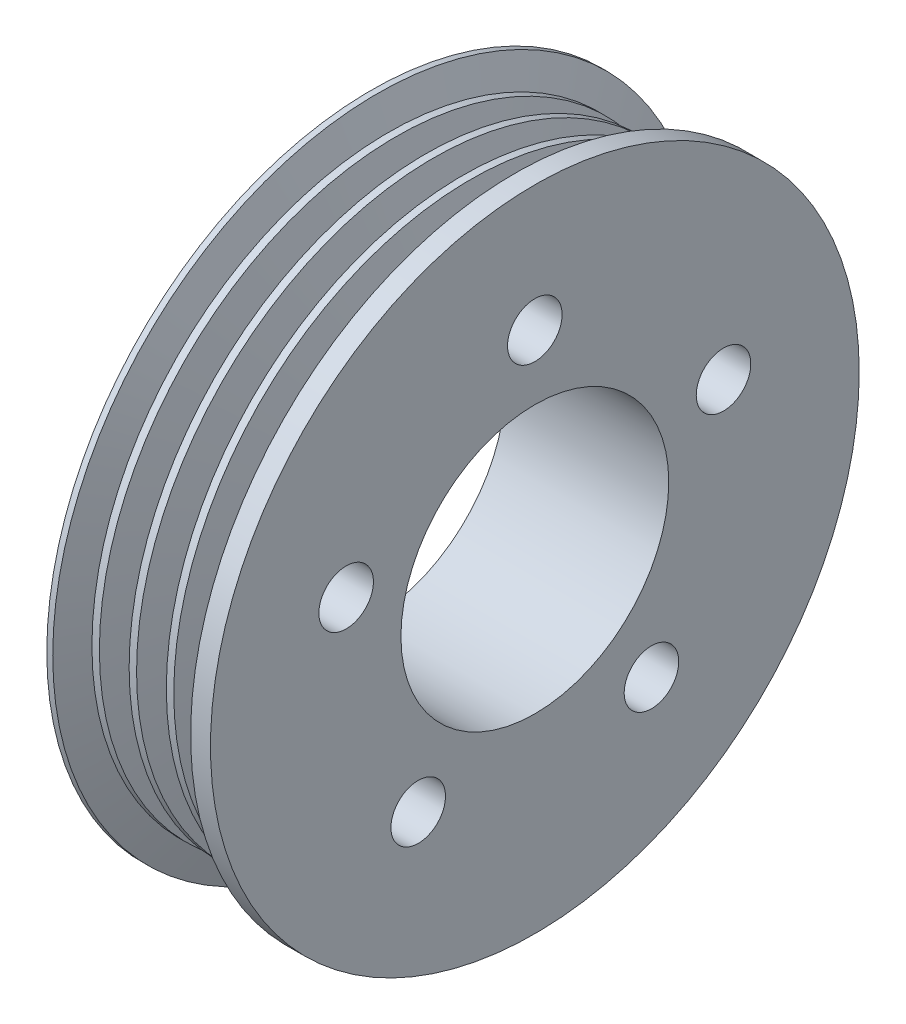
ISO-10303-21;
HEADER;
FILE_DESCRIPTION(('STEP AP214'),'2;1');
FILE_NAME('part.step','',(''),(''),'','','');
FILE_SCHEMA(('AUTOMOTIVE_DESIGN { 1 0 10303 214 1 1 1 1 }'));
ENDSEC;
DATA;
#1=APPLICATION_CONTEXT('core data for automotive mechanical design processes');
#2=APPLICATION_PROTOCOL_DEFINITION('international standard','automotive_design',2000,#1);
#3=PRODUCT_CONTEXT('',#1,'mechanical');
#4=PRODUCT('Part','Part','',(#3));
#5=PRODUCT_RELATED_PRODUCT_CATEGORY('part','',(#4));
#6=PRODUCT_DEFINITION_FORMATION('','',#4);
#7=PRODUCT_DEFINITION_CONTEXT('part definition',#1,'design');
#8=PRODUCT_DEFINITION('design','',#6,#7);
#9=PRODUCT_DEFINITION_SHAPE('','',#8);
#10=(LENGTH_UNIT() NAMED_UNIT(*) SI_UNIT(.MILLI.,.METRE.));
#11=(NAMED_UNIT(*) PLANE_ANGLE_UNIT() SI_UNIT($,.RADIAN.));
#12=(NAMED_UNIT(*) SI_UNIT($,.STERADIAN.) SOLID_ANGLE_UNIT());
#13=UNCERTAINTY_MEASURE_WITH_UNIT(LENGTH_MEASURE(1.E-05),#10,'distance_accuracy_value','');
#14=(GEOMETRIC_REPRESENTATION_CONTEXT(3) GLOBAL_UNCERTAINTY_ASSIGNED_CONTEXT((#13)) GLOBAL_UNIT_ASSIGNED_CONTEXT((#10,
#11,#12)) REPRESENTATION_CONTEXT('',''));
#15=CARTESIAN_POINT('',(0.,0.,0.));
#16=DIRECTION('',(0.,0.,1.));
#17=DIRECTION('',(1.,0.,0.));
#18=AXIS2_PLACEMENT_3D('',#15,#16,#17);
#19=CARTESIAN_POINT('',(0.,0.,0.));
#20=DIRECTION('',(-1.,0.,0.));
#21=DIRECTION('',(0.,0.,1.));
#22=AXIS2_PLACEMENT_3D('',#19,#20,#21);
#23=CYLINDRICAL_SURFACE('',#22,29.9);
#24=CARTESIAN_POINT('',(13.0000000000001,0.,0.));
#25=DIRECTION('',(-1.,0.,0.));
#26=DIRECTION('',(0.,0.,1.));
#27=AXIS2_PLACEMENT_3D('',#24,#25,#26);
#28=CIRCLE('',#27,29.9);
#29=CARTESIAN_POINT('',(13.0000000000001,0.,29.9));
#30=VERTEX_POINT('',#29);
#31=EDGE_CURVE('E168',#30,#30,#28,.T.);
#32=ORIENTED_EDGE('',*,*,#31,.F.);
#33=EDGE_LOOP('',(#32));
#34=FACE_BOUND('',#33,.T.);
#35=CARTESIAN_POINT('',(14.5000000000001,0.,0.));
#36=DIRECTION('',(1.,0.,0.));
#37=DIRECTION('',(0.,0.,-1.));
#38=AXIS2_PLACEMENT_3D('',#35,#36,#37);
#39=CIRCLE('',#38,29.9);
#40=CARTESIAN_POINT('',(14.5000000000001,0.,-29.9));
#41=VERTEX_POINT('',#40);
#42=EDGE_CURVE('E10',#41,#41,#39,.T.);
#43=ORIENTED_EDGE('',*,*,#42,.F.);
#44=EDGE_LOOP('',(#43));
#45=FACE_BOUND('',#44,.T.);
#46=ADVANCED_FACE('F36',(#34,#45),#23,.T.);
#47=CARTESIAN_POINT('',(0.,0.,0.));
#48=DIRECTION('',(-1.,0.,0.));
#49=DIRECTION('',(0.,0.,1.));
#50=AXIS2_PLACEMENT_3D('',#47,#48,#49);
#51=CYLINDRICAL_SURFACE('',#50,29.9);
#52=CARTESIAN_POINT('',(2.5,0.,0.));
#53=DIRECTION('',(-1.,0.,0.));
#54=DIRECTION('',(0.,0.,1.));
#55=AXIS2_PLACEMENT_3D('',#52,#53,#54);
#56=CIRCLE('',#55,29.9);
#57=CARTESIAN_POINT('',(2.5,0.,29.9));
#58=VERTEX_POINT('',#57);
#59=EDGE_CURVE('E124',#58,#58,#56,.T.);
#60=ORIENTED_EDGE('',*,*,#59,.T.);
#61=EDGE_LOOP('',(#60));
#62=FACE_BOUND('',#61,.T.);
#63=CARTESIAN_POINT('',(1.75,0.,0.));
#64=DIRECTION('',(-1.,0.,0.));
#65=DIRECTION('',(0.,0.,1.));
#66=AXIS2_PLACEMENT_3D('',#63,#64,#65);
#67=CIRCLE('',#66,29.9);
#68=CARTESIAN_POINT('',(1.75,0.,29.9));
#69=VERTEX_POINT('',#68);
#70=EDGE_CURVE('E40',#69,#69,#67,.T.);
#71=ORIENTED_EDGE('',*,*,#70,.F.);
#72=EDGE_LOOP('',(#71));
#73=FACE_BOUND('',#72,.T.);
#74=ADVANCED_FACE('F183',(#62,#73),#51,.T.);
#75=CARTESIAN_POINT('',(0.,29.9,0.));
#76=DIRECTION('',(1.,0.,0.));
#77=DIRECTION('',(0.,0.,-1.));
#78=AXIS2_PLACEMENT_3D('',#75,#76,#77);
#79=PLANE('',#78);
#80=CARTESIAN_POINT('',(0.,6.18033988749916,19.021130325903));
#81=DIRECTION('',(-1.,0.,0.));
#82=DIRECTION('',(0.,0.,1.));
#83=AXIS2_PLACEMENT_3D('',#80,#81,#82);
#84=CIRCLE('',#83,5.2);
#85=CARTESIAN_POINT('',(0.,6.18033988749916,24.221130325903));
#86=VERTEX_POINT('',#85);
#87=EDGE_CURVE('E64',#86,#86,#84,.T.);
#88=ORIENTED_EDGE('',*,*,#87,.F.);
#89=EDGE_LOOP('',(#88));
#90=FACE_BOUND('',#89,.T.);
#91=CARTESIAN_POINT('',(0.,-16.1803398874988,11.7557050458496));
#92=DIRECTION('',(-1.,0.,0.));
#93=DIRECTION('',(0.,0.,1.));
#94=AXIS2_PLACEMENT_3D('',#91,#92,#93);
#95=CIRCLE('',#94,5.2);
#96=CARTESIAN_POINT('',(0.,-16.1803398874988,16.9557050458496));
#97=VERTEX_POINT('',#96);
#98=EDGE_CURVE('E76',#97,#97,#95,.T.);
#99=ORIENTED_EDGE('',*,*,#98,.F.);
#100=EDGE_LOOP('',(#99));
#101=FACE_BOUND('',#100,.T.);
#102=CARTESIAN_POINT('',(0.,-16.180339887499,-11.7557050458494));
#103=DIRECTION('',(-1.,0.,0.));
#104=DIRECTION('',(0.,0.,1.));
#105=AXIS2_PLACEMENT_3D('',#102,#103,#104);
#106=CIRCLE('',#105,5.2);
#107=CARTESIAN_POINT('',(0.,-16.180339887499,-6.55570504584937));
#108=VERTEX_POINT('',#107);
#109=EDGE_CURVE('E88',#108,#108,#106,.T.);
#110=ORIENTED_EDGE('',*,*,#109,.F.);
#111=EDGE_LOOP('',(#110));
#112=FACE_BOUND('',#111,.T.);
#113=CARTESIAN_POINT('',(0.,6.1803398874989,-19.0211303259031));
#114=DIRECTION('',(-1.,0.,0.));
#115=DIRECTION('',(0.,0.,1.));
#116=AXIS2_PLACEMENT_3D('',#113,#114,#115);
#117=CIRCLE('',#116,5.2);
#118=CARTESIAN_POINT('',(0.,6.1803398874989,-13.8211303259031));
#119=VERTEX_POINT('',#118);
#120=EDGE_CURVE('E100',#119,#119,#117,.T.);
#121=ORIENTED_EDGE('',*,*,#120,.F.);
#122=EDGE_LOOP('',(#121));
#123=FACE_BOUND('',#122,.T.);
#124=CARTESIAN_POINT('',(0.,20.,0.));
#125=DIRECTION('',(-1.,0.,0.));
#126=DIRECTION('',(0.,0.,1.));
#127=AXIS2_PLACEMENT_3D('',#124,#125,#126);
#128=CIRCLE('',#127,5.2);
#129=CARTESIAN_POINT('',(0.,20.,5.2));
#130=VERTEX_POINT('',#129);
#131=EDGE_CURVE('E112',#130,#130,#128,.T.);
#132=ORIENTED_EDGE('',*,*,#131,.F.);
#133=EDGE_LOOP('',(#132));
#134=FACE_BOUND('',#133,.T.);
#135=CARTESIAN_POINT('',(0.,0.,0.));
#136=DIRECTION('',(-1.,0.,0.));
#137=DIRECTION('',(0.,0.,1.));
#138=AXIS2_PLACEMENT_3D('',#135,#136,#137);
#139=CIRCLE('',#138,13.5);
#140=CARTESIAN_POINT('',(0.,0.,13.5));
#141=VERTEX_POINT('',#140);
#142=EDGE_CURVE('E50',#141,#141,#139,.T.);
#143=ORIENTED_EDGE('',*,*,#142,.F.);
#144=EDGE_LOOP('',(#143));
#145=FACE_BOUND('',#144,.T.);
#146=CARTESIAN_POINT('',(0.,0.,0.));
#147=DIRECTION('',(-1.,0.,0.));
#148=DIRECTION('',(0.,0.,1.));
#149=AXIS2_PLACEMENT_3D('',#146,#147,#148);
#150=CIRCLE('',#149,32.7);
#151=CARTESIAN_POINT('',(0.,0.,32.7));
#152=VERTEX_POINT('',#151);
#153=EDGE_CURVE('E59',#152,#152,#150,.T.);
#154=ORIENTED_EDGE('',*,*,#153,.T.);
#155=EDGE_LOOP('',(#154));
#156=FACE_BOUND('',#155,.T.);
#157=ADVANCED_FACE('F38',(#90,#101,#112,#123,#134,#145,#156),#79,.F.);
#158=CARTESIAN_POINT('',(0.,0.,0.));
#159=DIRECTION('',(-1.,0.,0.));
#160=DIRECTION('',(0.,0.,1.));
#161=AXIS2_PLACEMENT_3D('',#158,#159,#160);
#162=CYLINDRICAL_SURFACE('',#161,13.5);
#163=CARTESIAN_POINT('',(16.5000000000001,0.,0.));
#164=DIRECTION('',(-1.,0.,0.));
#165=DIRECTION('',(0.,0.,1.));
#166=AXIS2_PLACEMENT_3D('',#163,#164,#165);
#167=CIRCLE('',#166,13.5);
#168=CARTESIAN_POINT('',(16.5000000000001,0.,13.5));
#169=VERTEX_POINT('',#168);
#170=EDGE_CURVE('E172',#169,#169,#167,.T.);
#171=ORIENTED_EDGE('',*,*,#170,.F.);
#172=EDGE_LOOP('',(#171));
#173=FACE_BOUND('',#172,.T.);
#174=ORIENTED_EDGE('',*,*,#142,.T.);
#175=EDGE_LOOP('',(#174));
#176=FACE_BOUND('',#175,.T.);
#177=ADVANCED_FACE('F179',(#173,#176),#162,.F.);
#178=CARTESIAN_POINT('',(16.5000000000001,29.9,0.));
#179=DIRECTION('',(-1.,0.,0.));
#180=DIRECTION('',(0.,0.,1.));
#181=AXIS2_PLACEMENT_3D('',#178,#179,#180);
#182=PLANE('',#181);
#183=CARTESIAN_POINT('',(16.5000000000001,6.18033988749916,19.021130325903));
#184=DIRECTION('',(-1.,0.,0.));
#185=DIRECTION('',(0.,0.,1.));
#186=AXIS2_PLACEMENT_3D('',#183,#184,#185);
#187=CIRCLE('',#186,2.75);
#188=CARTESIAN_POINT('',(16.5000000000001,6.18033988749916,21.771130325903));
#189=VERTEX_POINT('',#188);
#190=EDGE_CURVE('E72',#189,#189,#187,.T.);
#191=ORIENTED_EDGE('',*,*,#190,.T.);
#192=EDGE_LOOP('',(#191));
#193=FACE_BOUND('',#192,.T.);
#194=CARTESIAN_POINT('',(16.5000000000001,-16.1803398874988,11.7557050458496));
#195=DIRECTION('',(-1.,0.,0.));
#196=DIRECTION('',(0.,0.,1.));
#197=AXIS2_PLACEMENT_3D('',#194,#195,#196);
#198=CIRCLE('',#197,2.75);
#199=CARTESIAN_POINT('',(16.5000000000001,-16.1803398874988,14.5057050458496));
#200=VERTEX_POINT('',#199);
#201=EDGE_CURVE('E84',#200,#200,#198,.T.);
#202=ORIENTED_EDGE('',*,*,#201,.T.);
#203=EDGE_LOOP('',(#202));
#204=FACE_BOUND('',#203,.T.);
#205=CARTESIAN_POINT('',(16.5000000000001,-16.180339887499,-11.7557050458494));
#206=DIRECTION('',(-1.,0.,0.));
#207=DIRECTION('',(0.,0.,1.));
#208=AXIS2_PLACEMENT_3D('',#205,#206,#207);
#209=CIRCLE('',#208,2.75);
#210=CARTESIAN_POINT('',(16.5000000000001,-16.180339887499,-9.00570504584937));
#211=VERTEX_POINT('',#210);
#212=EDGE_CURVE('E96',#211,#211,#209,.T.);
#213=ORIENTED_EDGE('',*,*,#212,.T.);
#214=EDGE_LOOP('',(#213));
#215=FACE_BOUND('',#214,.T.);
#216=CARTESIAN_POINT('',(16.5000000000001,6.1803398874989,-19.0211303259031));
#217=DIRECTION('',(-1.,0.,0.));
#218=DIRECTION('',(0.,0.,1.));
#219=AXIS2_PLACEMENT_3D('',#216,#217,#218);
#220=CIRCLE('',#219,2.75);
#221=CARTESIAN_POINT('',(16.5000000000001,6.1803398874989,-16.2711303259031));
#222=VERTEX_POINT('',#221);
#223=EDGE_CURVE('E108',#222,#222,#220,.T.);
#224=ORIENTED_EDGE('',*,*,#223,.T.);
#225=EDGE_LOOP('',(#224));
#226=FACE_BOUND('',#225,.T.);
#227=CARTESIAN_POINT('',(16.5000000000001,20.,0.));
#228=DIRECTION('',(-1.,0.,0.));
#229=DIRECTION('',(0.,0.,1.));
#230=AXIS2_PLACEMENT_3D('',#227,#228,#229);
#231=CIRCLE('',#230,2.75);
#232=CARTESIAN_POINT('',(16.5000000000001,20.,2.75));
#233=VERTEX_POINT('',#232);
#234=EDGE_CURVE('E120',#233,#233,#231,.T.);
#235=ORIENTED_EDGE('',*,*,#234,.T.);
#236=EDGE_LOOP('',(#235));
#237=FACE_BOUND('',#236,.T.);
#238=ORIENTED_EDGE('',*,*,#170,.T.);
#239=EDGE_LOOP('',(#238));
#240=FACE_BOUND('',#239,.T.);
#241=CARTESIAN_POINT('',(16.5000000000001,0.,0.));
#242=DIRECTION('',(1.,0.,0.));
#243=DIRECTION('',(0.,0.,-1.));
#244=AXIS2_PLACEMENT_3D('',#241,#242,#243);
#245=CIRCLE('',#244,32.7);
#246=CARTESIAN_POINT('',(16.5000000000001,0.,-32.7));
#247=VERTEX_POINT('',#246);
#248=EDGE_CURVE('E53',#247,#247,#245,.T.);
#249=ORIENTED_EDGE('',*,*,#248,.T.);
#250=EDGE_LOOP('',(#249));
#251=FACE_BOUND('',#250,.T.);
#252=ADVANCED_FACE('F255',(#193,#204,#215,#226,#237,#240,#251),#182,.F.);
#253=CARTESIAN_POINT('',(13.0000000000001,0.,0.));
#254=DIRECTION('',(1.,0.,0.));
#255=DIRECTION('',(0.,0.,-1.));
#256=AXIS2_PLACEMENT_3D('',#253,#254,#255);
#257=CONICAL_SURFACE('',#256,29.9,1.3542460218188);
#258=CARTESIAN_POINT('',(11.9,0.,0.));
#259=DIRECTION('',(-1.,0.,0.));
#260=DIRECTION('',(0.,0.,1.));
#261=AXIS2_PLACEMENT_3D('',#258,#259,#260);
#262=CIRCLE('',#261,24.9);
#263=CARTESIAN_POINT('',(11.9,0.,24.9));
#264=VERTEX_POINT('',#263);
#265=EDGE_CURVE('E164',#264,#264,#262,.T.);
#266=ORIENTED_EDGE('',*,*,#265,.F.);
#267=EDGE_LOOP('',(#266));
#268=FACE_BOUND('',#267,.T.);
#269=ORIENTED_EDGE('',*,*,#31,.T.);
#270=EDGE_LOOP('',(#269));
#271=FACE_BOUND('',#270,.T.);
#272=ADVANCED_FACE('F252',(#268,#271),#257,.T.);
#273=CARTESIAN_POINT('',(0.,0.,0.));
#274=DIRECTION('',(-1.,0.,0.));
#275=DIRECTION('',(0.,0.,1.));
#276=AXIS2_PLACEMENT_3D('',#273,#274,#275);
#277=CYLINDRICAL_SURFACE('',#276,24.9);
#278=CARTESIAN_POINT('',(11.1,0.,0.));
#279=DIRECTION('',(-1.,0.,0.));
#280=DIRECTION('',(0.,0.,1.));
#281=AXIS2_PLACEMENT_3D('',#278,#279,#280);
#282=CIRCLE('',#281,24.9);
#283=CARTESIAN_POINT('',(11.1,0.,24.9));
#284=VERTEX_POINT('',#283);
#285=EDGE_CURVE('E160',#284,#284,#282,.T.);
#286=ORIENTED_EDGE('',*,*,#285,.F.);
#287=EDGE_LOOP('',(#286));
#288=FACE_BOUND('',#287,.T.);
#289=ORIENTED_EDGE('',*,*,#265,.T.);
#290=EDGE_LOOP('',(#289));
#291=FACE_BOUND('',#290,.T.);
#292=ADVANCED_FACE('F248',(#288,#291),#277,.T.);
#293=CARTESIAN_POINT('',(11.1,0.,0.));
#294=DIRECTION('',(-1.,0.,0.));
#295=DIRECTION('',(0.,0.,1.));
#296=AXIS2_PLACEMENT_3D('',#293,#294,#295);
#297=CONICAL_SURFACE('',#296,24.9,1.35424602181881);
#298=CARTESIAN_POINT('',(10.,0.,0.));
#299=DIRECTION('',(-1.,0.,0.));
#300=DIRECTION('',(0.,0.,1.));
#301=AXIS2_PLACEMENT_3D('',#298,#299,#300);
#302=CIRCLE('',#301,29.9);
#303=CARTESIAN_POINT('',(10.,0.,29.9));
#304=VERTEX_POINT('',#303);
#305=EDGE_CURVE('E156',#304,#304,#302,.T.);
#306=ORIENTED_EDGE('',*,*,#305,.F.);
#307=EDGE_LOOP('',(#306));
#308=FACE_BOUND('',#307,.T.);
#309=ORIENTED_EDGE('',*,*,#285,.T.);
#310=EDGE_LOOP('',(#309));
#311=FACE_BOUND('',#310,.T.);
#312=ADVANCED_FACE('F244',(#308,#311),#297,.T.);
#313=CARTESIAN_POINT('',(0.,0.,0.));
#314=DIRECTION('',(-1.,0.,0.));
#315=DIRECTION('',(0.,0.,1.));
#316=AXIS2_PLACEMENT_3D('',#313,#314,#315);
#317=CYLINDRICAL_SURFACE('',#316,29.9);
#318=CARTESIAN_POINT('',(9.24999999999998,0.,0.));
#319=DIRECTION('',(-1.,0.,0.));
#320=DIRECTION('',(0.,0.,1.));
#321=AXIS2_PLACEMENT_3D('',#318,#319,#320);
#322=CIRCLE('',#321,29.9);
#323=CARTESIAN_POINT('',(9.24999999999998,0.,29.9));
#324=VERTEX_POINT('',#323);
#325=EDGE_CURVE('E152',#324,#324,#322,.T.);
#326=ORIENTED_EDGE('',*,*,#325,.F.);
#327=EDGE_LOOP('',(#326));
#328=FACE_BOUND('',#327,.T.);
#329=ORIENTED_EDGE('',*,*,#305,.T.);
#330=EDGE_LOOP('',(#329));
#331=FACE_BOUND('',#330,.T.);
#332=ADVANCED_FACE('F240',(#328,#331),#317,.T.);
#333=CARTESIAN_POINT('',(9.24999999999998,0.,0.));
#334=DIRECTION('',(1.,0.,0.));
#335=DIRECTION('',(0.,0.,-1.));
#336=AXIS2_PLACEMENT_3D('',#333,#334,#335);
#337=CONICAL_SURFACE('',#336,29.9,1.35424602181881);
#338=CARTESIAN_POINT('',(8.14999999999999,0.,0.));
#339=DIRECTION('',(-1.,0.,0.));
#340=DIRECTION('',(0.,0.,1.));
#341=AXIS2_PLACEMENT_3D('',#338,#339,#340);
#342=CIRCLE('',#341,24.9);
#343=CARTESIAN_POINT('',(8.14999999999999,0.,24.9));
#344=VERTEX_POINT('',#343);
#345=EDGE_CURVE('E148',#344,#344,#342,.T.);
#346=ORIENTED_EDGE('',*,*,#345,.F.);
#347=EDGE_LOOP('',(#346));
#348=FACE_BOUND('',#347,.T.);
#349=ORIENTED_EDGE('',*,*,#325,.T.);
#350=EDGE_LOOP('',(#349));
#351=FACE_BOUND('',#350,.T.);
#352=ADVANCED_FACE('F236',(#348,#351),#337,.T.);
#353=CARTESIAN_POINT('',(0.,0.,0.));
#354=DIRECTION('',(-1.,0.,0.));
#355=DIRECTION('',(0.,0.,1.));
#356=AXIS2_PLACEMENT_3D('',#353,#354,#355);
#357=CYLINDRICAL_SURFACE('',#356,24.9);
#358=CARTESIAN_POINT('',(7.35000000000001,0.,0.));
#359=DIRECTION('',(-1.,0.,0.));
#360=DIRECTION('',(0.,0.,1.));
#361=AXIS2_PLACEMENT_3D('',#358,#359,#360);
#362=CIRCLE('',#361,24.9);
#363=CARTESIAN_POINT('',(7.35000000000001,0.,24.9));
#364=VERTEX_POINT('',#363);
#365=EDGE_CURVE('E144',#364,#364,#362,.T.);
#366=ORIENTED_EDGE('',*,*,#365,.F.);
#367=EDGE_LOOP('',(#366));
#368=FACE_BOUND('',#367,.T.);
#369=ORIENTED_EDGE('',*,*,#345,.T.);
#370=EDGE_LOOP('',(#369));
#371=FACE_BOUND('',#370,.T.);
#372=ADVANCED_FACE('F232',(#368,#371),#357,.T.);
#373=CARTESIAN_POINT('',(7.35000000000001,0.,0.));
#374=DIRECTION('',(-1.,0.,0.));
#375=DIRECTION('',(0.,0.,1.));
#376=AXIS2_PLACEMENT_3D('',#373,#374,#375);
#377=CONICAL_SURFACE('',#376,24.9,1.35424602181881);
#378=CARTESIAN_POINT('',(6.25000000000001,0.,0.));
#379=DIRECTION('',(-1.,0.,0.));
#380=DIRECTION('',(0.,0.,1.));
#381=AXIS2_PLACEMENT_3D('',#378,#379,#380);
#382=CIRCLE('',#381,29.9);
#383=CARTESIAN_POINT('',(6.25000000000001,0.,29.9));
#384=VERTEX_POINT('',#383);
#385=EDGE_CURVE('E140',#384,#384,#382,.T.);
#386=ORIENTED_EDGE('',*,*,#385,.F.);
#387=EDGE_LOOP('',(#386));
#388=FACE_BOUND('',#387,.T.);
#389=ORIENTED_EDGE('',*,*,#365,.T.);
#390=EDGE_LOOP('',(#389));
#391=FACE_BOUND('',#390,.T.);
#392=ADVANCED_FACE('F228',(#388,#391),#377,.T.);
#393=CARTESIAN_POINT('',(0.,0.,0.));
#394=DIRECTION('',(-1.,0.,0.));
#395=DIRECTION('',(0.,0.,1.));
#396=AXIS2_PLACEMENT_3D('',#393,#394,#395);
#397=CYLINDRICAL_SURFACE('',#396,29.9);
#398=CARTESIAN_POINT('',(5.49999999999999,0.,0.));
#399=DIRECTION('',(-1.,0.,0.));
#400=DIRECTION('',(0.,0.,1.));
#401=AXIS2_PLACEMENT_3D('',#398,#399,#400);
#402=CIRCLE('',#401,29.9);
#403=CARTESIAN_POINT('',(5.49999999999999,0.,29.9));
#404=VERTEX_POINT('',#403);
#405=EDGE_CURVE('E136',#404,#404,#402,.T.);
#406=ORIENTED_EDGE('',*,*,#405,.F.);
#407=EDGE_LOOP('',(#406));
#408=FACE_BOUND('',#407,.T.);
#409=ORIENTED_EDGE('',*,*,#385,.T.);
#410=EDGE_LOOP('',(#409));
#411=FACE_BOUND('',#410,.T.);
#412=ADVANCED_FACE('F224',(#408,#411),#397,.T.);
#413=CARTESIAN_POINT('',(5.49999999999999,0.,0.));
#414=DIRECTION('',(1.,0.,0.));
#415=DIRECTION('',(0.,0.,-1.));
#416=AXIS2_PLACEMENT_3D('',#413,#414,#415);
#417=CONICAL_SURFACE('',#416,29.9,1.35424602181881);
#418=CARTESIAN_POINT('',(4.4,0.,0.));
#419=DIRECTION('',(-1.,0.,0.));
#420=DIRECTION('',(0.,0.,1.));
#421=AXIS2_PLACEMENT_3D('',#418,#419,#420);
#422=CIRCLE('',#421,24.9);
#423=CARTESIAN_POINT('',(4.4,0.,24.9));
#424=VERTEX_POINT('',#423);
#425=EDGE_CURVE('E132',#424,#424,#422,.T.);
#426=ORIENTED_EDGE('',*,*,#425,.F.);
#427=EDGE_LOOP('',(#426));
#428=FACE_BOUND('',#427,.T.);
#429=ORIENTED_EDGE('',*,*,#405,.T.);
#430=EDGE_LOOP('',(#429));
#431=FACE_BOUND('',#430,.T.);
#432=ADVANCED_FACE('F220',(#428,#431),#417,.T.);
#433=CARTESIAN_POINT('',(0.,0.,0.));
#434=DIRECTION('',(-1.,0.,0.));
#435=DIRECTION('',(0.,0.,1.));
#436=AXIS2_PLACEMENT_3D('',#433,#434,#435);
#437=CYLINDRICAL_SURFACE('',#436,24.9);
#438=CARTESIAN_POINT('',(3.6,0.,0.));
#439=DIRECTION('',(-1.,0.,0.));
#440=DIRECTION('',(0.,0.,1.));
#441=AXIS2_PLACEMENT_3D('',#438,#439,#440);
#442=CIRCLE('',#441,24.9);
#443=CARTESIAN_POINT('',(3.6,0.,24.9));
#444=VERTEX_POINT('',#443);
#445=EDGE_CURVE('E128',#444,#444,#442,.T.);
#446=ORIENTED_EDGE('',*,*,#445,.F.);
#447=EDGE_LOOP('',(#446));
#448=FACE_BOUND('',#447,.T.);
#449=ORIENTED_EDGE('',*,*,#425,.T.);
#450=EDGE_LOOP('',(#449));
#451=FACE_BOUND('',#450,.T.);
#452=ADVANCED_FACE('F216',(#448,#451),#437,.T.);
#453=CARTESIAN_POINT('',(3.6,0.,0.));
#454=DIRECTION('',(-1.,0.,0.));
#455=DIRECTION('',(0.,0.,1.));
#456=AXIS2_PLACEMENT_3D('',#453,#454,#455);
#457=CONICAL_SURFACE('',#456,24.9,1.35424602181881);
#458=ORIENTED_EDGE('',*,*,#59,.F.);
#459=EDGE_LOOP('',(#458));
#460=FACE_BOUND('',#459,.T.);
#461=ORIENTED_EDGE('',*,*,#445,.T.);
#462=EDGE_LOOP('',(#461));
#463=FACE_BOUND('',#462,.T.);
#464=ADVANCED_FACE('F213',(#460,#463),#457,.T.);
#465=CARTESIAN_POINT('',(0.,20.,0.));
#466=DIRECTION('',(-1.,0.,0.));
#467=DIRECTION('',(0.,0.,1.));
#468=AXIS2_PLACEMENT_3D('',#465,#466,#467);
#469=CYLINDRICAL_SURFACE('',#468,2.75);
#470=ORIENTED_EDGE('',*,*,#234,.F.);
#471=EDGE_LOOP('',(#470));
#472=FACE_BOUND('',#471,.T.);
#473=CARTESIAN_POINT('',(2.45,20.,0.));
#474=DIRECTION('',(-1.,0.,0.));
#475=DIRECTION('',(0.,0.,1.));
#476=AXIS2_PLACEMENT_3D('',#473,#474,#475);
#477=CIRCLE('',#476,2.75);
#478=CARTESIAN_POINT('',(2.45,20.,2.75));
#479=VERTEX_POINT('',#478);
#480=EDGE_CURVE('E116',#479,#479,#477,.T.);
#481=ORIENTED_EDGE('',*,*,#480,.T.);
#482=EDGE_LOOP('',(#481));
#483=FACE_BOUND('',#482,.T.);
#484=ADVANCED_FACE('F211',(#472,#483),#469,.F.);
#485=CARTESIAN_POINT('',(0.,20.,0.));
#486=DIRECTION('',(-1.,0.,0.));
#487=DIRECTION('',(0.,0.,1.));
#488=AXIS2_PLACEMENT_3D('',#485,#486,#487);
#489=CONICAL_SURFACE('',#488,5.2,0.785398163397448);
#490=ORIENTED_EDGE('',*,*,#480,.F.);
#491=EDGE_LOOP('',(#490));
#492=FACE_BOUND('',#491,.T.);
#493=ORIENTED_EDGE('',*,*,#131,.T.);
#494=EDGE_LOOP('',(#493));
#495=FACE_BOUND('',#494,.T.);
#496=ADVANCED_FACE('F313',(#492,#495),#489,.F.);
#497=CARTESIAN_POINT('',(0.,6.1803398874989,-19.0211303259031));
#498=DIRECTION('',(-1.,0.,0.));
#499=DIRECTION('',(0.,0.,1.));
#500=AXIS2_PLACEMENT_3D('',#497,#498,#499);
#501=CYLINDRICAL_SURFACE('',#500,2.75);
#502=ORIENTED_EDGE('',*,*,#223,.F.);
#503=EDGE_LOOP('',(#502));
#504=FACE_BOUND('',#503,.T.);
#505=CARTESIAN_POINT('',(2.45,6.1803398874989,-19.0211303259031));
#506=DIRECTION('',(-1.,0.,0.));
#507=DIRECTION('',(0.,0.,1.));
#508=AXIS2_PLACEMENT_3D('',#505,#506,#507);
#509=CIRCLE('',#508,2.75);
#510=CARTESIAN_POINT('',(2.45,6.1803398874989,-16.2711303259031));
#511=VERTEX_POINT('',#510);
#512=EDGE_CURVE('E104',#511,#511,#509,.T.);
#513=ORIENTED_EDGE('',*,*,#512,.T.);
#514=EDGE_LOOP('',(#513));
#515=FACE_BOUND('',#514,.T.);
#516=ADVANCED_FACE('F310',(#504,#515),#501,.F.);
#517=CARTESIAN_POINT('',(0.,6.1803398874989,-19.0211303259031));
#518=DIRECTION('',(-1.,0.,0.));
#519=DIRECTION('',(0.,0.,1.));
#520=AXIS2_PLACEMENT_3D('',#517,#518,#519);
#521=CONICAL_SURFACE('',#520,5.2,0.785398163397449);
#522=ORIENTED_EDGE('',*,*,#512,.F.);
#523=EDGE_LOOP('',(#522));
#524=FACE_BOUND('',#523,.T.);
#525=ORIENTED_EDGE('',*,*,#120,.T.);
#526=EDGE_LOOP('',(#525));
#527=FACE_BOUND('',#526,.T.);
#528=ADVANCED_FACE('F306',(#524,#527),#521,.F.);
#529=CARTESIAN_POINT('',(0.,-16.180339887499,-11.7557050458494));
#530=DIRECTION('',(-1.,0.,0.));
#531=DIRECTION('',(0.,0.,1.));
#532=AXIS2_PLACEMENT_3D('',#529,#530,#531);
#533=CYLINDRICAL_SURFACE('',#532,2.75);
#534=ORIENTED_EDGE('',*,*,#212,.F.);
#535=EDGE_LOOP('',(#534));
#536=FACE_BOUND('',#535,.T.);
#537=CARTESIAN_POINT('',(2.45,-16.180339887499,-11.7557050458494));
#538=DIRECTION('',(-1.,0.,0.));
#539=DIRECTION('',(0.,0.,1.));
#540=AXIS2_PLACEMENT_3D('',#537,#538,#539);
#541=CIRCLE('',#540,2.75);
#542=CARTESIAN_POINT('',(2.45,-16.180339887499,-9.00570504584937));
#543=VERTEX_POINT('',#542);
#544=EDGE_CURVE('E92',#543,#543,#541,.T.);
#545=ORIENTED_EDGE('',*,*,#544,.T.);
#546=EDGE_LOOP('',(#545));
#547=FACE_BOUND('',#546,.T.);
#548=ADVANCED_FACE('F302',(#536,#547),#533,.F.);
#549=CARTESIAN_POINT('',(0.,-16.180339887499,-11.7557050458494));
#550=DIRECTION('',(-1.,0.,0.));
#551=DIRECTION('',(0.,0.,1.));
#552=AXIS2_PLACEMENT_3D('',#549,#550,#551);
#553=CONICAL_SURFACE('',#552,5.2,0.785398163397448);
#554=ORIENTED_EDGE('',*,*,#544,.F.);
#555=EDGE_LOOP('',(#554));
#556=FACE_BOUND('',#555,.T.);
#557=ORIENTED_EDGE('',*,*,#109,.T.);
#558=EDGE_LOOP('',(#557));
#559=FACE_BOUND('',#558,.T.);
#560=ADVANCED_FACE('F298',(#556,#559),#553,.F.);
#561=CARTESIAN_POINT('',(0.,-16.1803398874988,11.7557050458496));
#562=DIRECTION('',(-1.,0.,0.));
#563=DIRECTION('',(0.,0.,1.));
#564=AXIS2_PLACEMENT_3D('',#561,#562,#563);
#565=CYLINDRICAL_SURFACE('',#564,2.75);
#566=ORIENTED_EDGE('',*,*,#201,.F.);
#567=EDGE_LOOP('',(#566));
#568=FACE_BOUND('',#567,.T.);
#569=CARTESIAN_POINT('',(2.45,-16.1803398874988,11.7557050458496));
#570=DIRECTION('',(-1.,0.,0.));
#571=DIRECTION('',(0.,0.,1.));
#572=AXIS2_PLACEMENT_3D('',#569,#570,#571);
#573=CIRCLE('',#572,2.75);
#574=CARTESIAN_POINT('',(2.45,-16.1803398874988,14.5057050458496));
#575=VERTEX_POINT('',#574);
#576=EDGE_CURVE('E80',#575,#575,#573,.T.);
#577=ORIENTED_EDGE('',*,*,#576,.T.);
#578=EDGE_LOOP('',(#577));
#579=FACE_BOUND('',#578,.T.);
#580=ADVANCED_FACE('F294',(#568,#579),#565,.F.);
#581=CARTESIAN_POINT('',(0.,-16.1803398874988,11.7557050458496));
#582=DIRECTION('',(-1.,0.,0.));
#583=DIRECTION('',(0.,0.,1.));
#584=AXIS2_PLACEMENT_3D('',#581,#582,#583);
#585=CONICAL_SURFACE('',#584,5.2,0.785398163397448);
#586=ORIENTED_EDGE('',*,*,#576,.F.);
#587=EDGE_LOOP('',(#586));
#588=FACE_BOUND('',#587,.T.);
#589=ORIENTED_EDGE('',*,*,#98,.T.);
#590=EDGE_LOOP('',(#589));
#591=FACE_BOUND('',#590,.T.);
#592=ADVANCED_FACE('F290',(#588,#591),#585,.F.);
#593=CARTESIAN_POINT('',(0.,6.18033988749916,19.021130325903));
#594=DIRECTION('',(-1.,0.,0.));
#595=DIRECTION('',(0.,0.,1.));
#596=AXIS2_PLACEMENT_3D('',#593,#594,#595);
#597=CYLINDRICAL_SURFACE('',#596,2.75);
#598=ORIENTED_EDGE('',*,*,#190,.F.);
#599=EDGE_LOOP('',(#598));
#600=FACE_BOUND('',#599,.T.);
#601=CARTESIAN_POINT('',(2.45,6.18033988749916,19.021130325903));
#602=DIRECTION('',(-1.,0.,0.));
#603=DIRECTION('',(0.,0.,1.));
#604=AXIS2_PLACEMENT_3D('',#601,#602,#603);
#605=CIRCLE('',#604,2.75);
#606=CARTESIAN_POINT('',(2.45,6.18033988749916,21.771130325903));
#607=VERTEX_POINT('',#606);
#608=EDGE_CURVE('E68',#607,#607,#605,.T.);
#609=ORIENTED_EDGE('',*,*,#608,.T.);
#610=EDGE_LOOP('',(#609));
#611=FACE_BOUND('',#610,.T.);
#612=ADVANCED_FACE('F286',(#600,#611),#597,.F.);
#613=CARTESIAN_POINT('',(0.,6.18033988749916,19.021130325903));
#614=DIRECTION('',(-1.,0.,0.));
#615=DIRECTION('',(0.,0.,1.));
#616=AXIS2_PLACEMENT_3D('',#613,#614,#615);
#617=CONICAL_SURFACE('',#616,5.2,0.785398163397448);
#618=ORIENTED_EDGE('',*,*,#608,.F.);
#619=EDGE_LOOP('',(#618));
#620=FACE_BOUND('',#619,.T.);
#621=ORIENTED_EDGE('',*,*,#87,.T.);
#622=EDGE_LOOP('',(#621));
#623=FACE_BOUND('',#622,.T.);
#624=ADVANCED_FACE('F191',(#620,#623),#617,.F.);
#625=CARTESIAN_POINT('',(0.,0.,0.));
#626=DIRECTION('',(-1.,0.,0.));
#627=DIRECTION('',(0.,0.,1.));
#628=AXIS2_PLACEMENT_3D('',#625,#626,#627);
#629=CYLINDRICAL_SURFACE('',#628,32.7);
#630=ORIENTED_EDGE('',*,*,#153,.F.);
#631=EDGE_LOOP('',(#630));
#632=FACE_BOUND('',#631,.T.);
#633=CARTESIAN_POINT('',(0.6,0.,0.));
#634=DIRECTION('',(-1.,0.,0.));
#635=DIRECTION('',(0.,0.,1.));
#636=AXIS2_PLACEMENT_3D('',#633,#634,#635);
#637=CIRCLE('',#636,32.7);
#638=CARTESIAN_POINT('',(0.6,0.,32.7));
#639=VERTEX_POINT('',#638);
#640=EDGE_CURVE('E55',#639,#639,#637,.T.);
#641=ORIENTED_EDGE('',*,*,#640,.T.);
#642=EDGE_LOOP('',(#641));
#643=FACE_BOUND('',#642,.T.);
#644=ADVANCED_FACE('F187',(#632,#643),#629,.T.);
#645=CARTESIAN_POINT('',(1.75,0.,0.));
#646=DIRECTION('',(-1.,0.,0.));
#647=DIRECTION('',(0.,0.,1.));
#648=AXIS2_PLACEMENT_3D('',#645,#646,#647);
#649=CONICAL_SURFACE('',#648,29.9,1.18108775545203);
#650=ORIENTED_EDGE('',*,*,#640,.F.);
#651=EDGE_LOOP('',(#650));
#652=FACE_BOUND('',#651,.T.);
#653=ORIENTED_EDGE('',*,*,#70,.T.);
#654=EDGE_LOOP('',(#653));
#655=FACE_BOUND('',#654,.T.);
#656=ADVANCED_FACE('F190',(#652,#655),#649,.T.);
#657=CARTESIAN_POINT('',(14.5000000000001,0.,0.));
#658=DIRECTION('',(1.,0.,0.));
#659=DIRECTION('',(0.,0.,-1.));
#660=AXIS2_PLACEMENT_3D('',#657,#658,#659);
#661=PLANE('',#660);
#662=CARTESIAN_POINT('',(14.5000000000001,0.,0.));
#663=DIRECTION('',(1.,0.,0.));
#664=DIRECTION('',(0.,0.,-1.));
#665=AXIS2_PLACEMENT_3D('',#662,#663,#664);
#666=CIRCLE('',#665,32.7);
#667=CARTESIAN_POINT('',(14.5000000000001,0.,-32.7));
#668=VERTEX_POINT('',#667);
#669=EDGE_CURVE('E60',#668,#668,#666,.T.);
#670=ORIENTED_EDGE('',*,*,#669,.F.);
#671=EDGE_LOOP('',(#670));
#672=FACE_BOUND('',#671,.T.);
#673=ORIENTED_EDGE('',*,*,#42,.T.);
#674=EDGE_LOOP('',(#673));
#675=FACE_BOUND('',#674,.T.);
#676=ADVANCED_FACE('F197',(#672,#675),#661,.F.);
#677=CARTESIAN_POINT('',(14.5000000000001,0.,0.));
#678=DIRECTION('',(1.,0.,0.));
#679=DIRECTION('',(0.,0.,-1.));
#680=AXIS2_PLACEMENT_3D('',#677,#678,#679);
#681=CYLINDRICAL_SURFACE('',#680,32.7);
#682=ORIENTED_EDGE('',*,*,#669,.T.);
#683=EDGE_LOOP('',(#682));
#684=FACE_BOUND('',#683,.T.);
#685=ORIENTED_EDGE('',*,*,#248,.F.);
#686=EDGE_LOOP('',(#685));
#687=FACE_BOUND('',#686,.T.);
#688=ADVANCED_FACE('F275',(#684,#687),#681,.T.);
#689=CLOSED_SHELL('',(#46,#74,#157,#177,#252,#272,#292,#312,#332,#352,#372,#392,#412,#432,#452,
#464,#484,#496,#516,#528,#548,#560,#580,#592,#612,#624,#644,#656,#676,#688));
#690=MANIFOLD_SOLID_BREP('B2',#689);
#691=ADVANCED_BREP_SHAPE_REPRESENTATION('',(#18,#690),#14);
#692=SHAPE_DEFINITION_REPRESENTATION(#9,#691);
ENDSEC;
END-ISO-10303-21;
